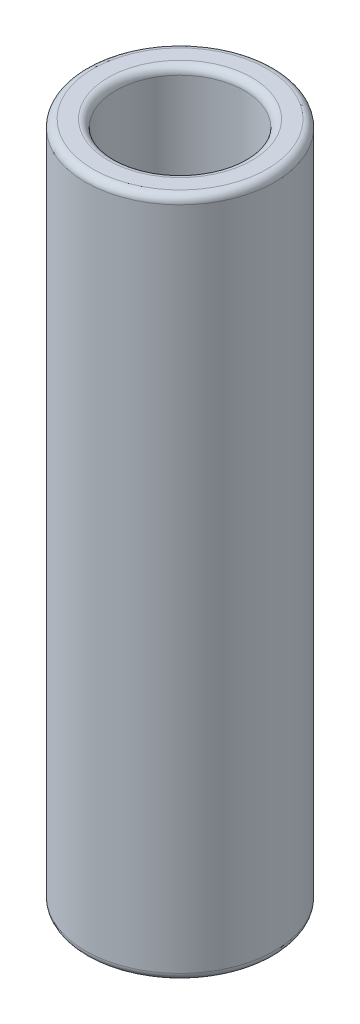
ISO-10303-21;
HEADER;
FILE_DESCRIPTION(('STEP AP214'),'2;1');
FILE_NAME('part.step','',(''),(''),'','','');
FILE_SCHEMA(('AUTOMOTIVE_DESIGN { 1 0 10303 214 1 1 1 1 }'));
ENDSEC;
DATA;
#1=APPLICATION_CONTEXT('core data for automotive mechanical design processes');
#2=APPLICATION_PROTOCOL_DEFINITION('international standard','automotive_design',2000,#1);
#3=PRODUCT_CONTEXT('',#1,'mechanical');
#4=PRODUCT('Part','Part','',(#3));
#5=PRODUCT_RELATED_PRODUCT_CATEGORY('part','',(#4));
#6=PRODUCT_DEFINITION_FORMATION('','',#4);
#7=PRODUCT_DEFINITION_CONTEXT('part definition',#1,'design');
#8=PRODUCT_DEFINITION('design','',#6,#7);
#9=PRODUCT_DEFINITION_SHAPE('','',#8);
#10=(LENGTH_UNIT() NAMED_UNIT(*) SI_UNIT(.MILLI.,.METRE.));
#11=(NAMED_UNIT(*) PLANE_ANGLE_UNIT() SI_UNIT($,.RADIAN.));
#12=(NAMED_UNIT(*) SI_UNIT($,.STERADIAN.) SOLID_ANGLE_UNIT());
#13=UNCERTAINTY_MEASURE_WITH_UNIT(LENGTH_MEASURE(1.E-05),#10,'distance_accuracy_value','');
#14=(GEOMETRIC_REPRESENTATION_CONTEXT(3) GLOBAL_UNCERTAINTY_ASSIGNED_CONTEXT((#13)) GLOBAL_UNIT_ASSIGNED_CONTEXT((#10,
#11,#12)) REPRESENTATION_CONTEXT('',''));
#15=CARTESIAN_POINT('',(0.,0.,0.));
#16=DIRECTION('',(0.,0.,1.));
#17=DIRECTION('',(1.,0.,0.));
#18=AXIS2_PLACEMENT_3D('',#15,#16,#17);
#19=CARTESIAN_POINT('',(0.,18.,0.));
#20=DIRECTION('',(0.,1.,0.));
#21=DIRECTION('',(0.,0.,1.));
#22=AXIS2_PLACEMENT_3D('',#19,#20,#21);
#23=PLANE('',#22);
#24=CARTESIAN_POINT('',(0.,18.,0.));
#25=DIRECTION('',(0.,1.,0.));
#26=DIRECTION('',(0.,0.,1.));
#27=AXIS2_PLACEMENT_3D('',#24,#25,#26);
#28=CIRCLE('',#27,1.9);
#29=CARTESIAN_POINT('',(0.,18.,1.9));
#30=VERTEX_POINT('',#29);
#31=EDGE_CURVE('E10',#30,#30,#28,.F.);
#32=ORIENTED_EDGE('',*,*,#31,.T.);
#33=EDGE_LOOP('',(#32));
#34=FACE_BOUND('',#33,.T.);
#35=CARTESIAN_POINT('',(0.,18.,0.));
#36=DIRECTION('',(0.,1.,0.));
#37=DIRECTION('',(0.,0.,1.));
#38=AXIS2_PLACEMENT_3D('',#35,#36,#37);
#39=CIRCLE('',#38,2.3);
#40=CARTESIAN_POINT('',(0.,18.,2.3));
#41=VERTEX_POINT('',#40);
#42=EDGE_CURVE('E42',#41,#41,#39,.T.);
#43=ORIENTED_EDGE('',*,*,#42,.T.);
#44=EDGE_LOOP('',(#43));
#45=FACE_BOUND('',#44,.T.);
#46=ADVANCED_FACE('F35',(#34,#45),#23,.T.);
#47=CARTESIAN_POINT('',(0.,0.,0.));
#48=DIRECTION('',(0.,1.,0.));
#49=DIRECTION('',(0.,0.,1.));
#50=AXIS2_PLACEMENT_3D('',#47,#48,#49);
#51=PLANE('',#50);
#52=CARTESIAN_POINT('',(0.,0.,0.));
#53=DIRECTION('',(0.,1.,0.));
#54=DIRECTION('',(0.,0.,1.));
#55=AXIS2_PLACEMENT_3D('',#52,#53,#54);
#56=CIRCLE('',#55,1.9);
#57=CARTESIAN_POINT('',(0.,0.,1.9));
#58=VERTEX_POINT('',#57);
#59=EDGE_CURVE('E61',#58,#58,#56,.T.);
#60=ORIENTED_EDGE('',*,*,#59,.T.);
#61=EDGE_LOOP('',(#60));
#62=FACE_BOUND('',#61,.T.);
#63=CARTESIAN_POINT('',(0.,0.,0.));
#64=DIRECTION('',(0.,1.,0.));
#65=DIRECTION('',(0.,0.,1.));
#66=AXIS2_PLACEMENT_3D('',#63,#64,#65);
#67=CIRCLE('',#66,2.3);
#68=CARTESIAN_POINT('',(0.,0.,2.3));
#69=VERTEX_POINT('',#68);
#70=EDGE_CURVE('E64',#69,#69,#67,.F.);
#71=ORIENTED_EDGE('',*,*,#70,.T.);
#72=EDGE_LOOP('',(#71));
#73=FACE_BOUND('',#72,.T.);
#74=ADVANCED_FACE('F68',(#62,#73),#51,.F.);
#75=CARTESIAN_POINT('',(0.,18.,0.));
#76=DIRECTION('',(0.,-1.,0.));
#77=DIRECTION('',(0.,0.,-1.));
#78=AXIS2_PLACEMENT_3D('',#75,#76,#77);
#79=CYLINDRICAL_SURFACE('',#78,2.5);
#80=CARTESIAN_POINT('',(0.,0.199999999999999,0.));
#81=DIRECTION('',(0.,1.,0.));
#82=DIRECTION('',(0.,0.,1.));
#83=AXIS2_PLACEMENT_3D('',#80,#81,#82);
#84=CIRCLE('',#83,2.5);
#85=CARTESIAN_POINT('',(0.,0.199999999999999,2.5));
#86=VERTEX_POINT('',#85);
#87=EDGE_CURVE('E46',#86,#86,#84,.T.);
#88=ORIENTED_EDGE('',*,*,#87,.T.);
#89=EDGE_LOOP('',(#88));
#90=FACE_BOUND('',#89,.T.);
#91=CARTESIAN_POINT('',(0.,17.8,0.));
#92=DIRECTION('',(0.,1.,0.));
#93=DIRECTION('',(0.,0.,1.));
#94=AXIS2_PLACEMENT_3D('',#91,#92,#93);
#95=CIRCLE('',#94,2.5);
#96=CARTESIAN_POINT('',(0.,17.8,2.5));
#97=VERTEX_POINT('',#96);
#98=EDGE_CURVE('E50',#97,#97,#95,.F.);
#99=ORIENTED_EDGE('',*,*,#98,.T.);
#100=EDGE_LOOP('',(#99));
#101=FACE_BOUND('',#100,.T.);
#102=ADVANCED_FACE('F78',(#90,#101),#79,.T.);
#103=CARTESIAN_POINT('',(0.,18.,0.));
#104=DIRECTION('',(0.,-1.,0.));
#105=DIRECTION('',(0.,0.,-1.));
#106=AXIS2_PLACEMENT_3D('',#103,#104,#105);
#107=CYLINDRICAL_SURFACE('',#106,1.7);
#108=CARTESIAN_POINT('',(0.,0.199999999999999,0.));
#109=DIRECTION('',(0.,1.,0.));
#110=DIRECTION('',(0.,0.,1.));
#111=AXIS2_PLACEMENT_3D('',#108,#109,#110);
#112=CIRCLE('',#111,1.7);
#113=CARTESIAN_POINT('',(0.,0.199999999999999,1.7));
#114=VERTEX_POINT('',#113);
#115=EDGE_CURVE('E55',#114,#114,#112,.F.);
#116=ORIENTED_EDGE('',*,*,#115,.T.);
#117=EDGE_LOOP('',(#116));
#118=FACE_BOUND('',#117,.T.);
#119=CARTESIAN_POINT('',(0.,17.8,0.));
#120=DIRECTION('',(0.,1.,0.));
#121=DIRECTION('',(0.,0.,1.));
#122=AXIS2_PLACEMENT_3D('',#119,#120,#121);
#123=CIRCLE('',#122,1.7);
#124=CARTESIAN_POINT('',(0.,17.8,1.7));
#125=VERTEX_POINT('',#124);
#126=EDGE_CURVE('E58',#125,#125,#123,.T.);
#127=ORIENTED_EDGE('',*,*,#126,.T.);
#128=EDGE_LOOP('',(#127));
#129=FACE_BOUND('',#128,.T.);
#130=ADVANCED_FACE('F81',(#118,#129),#107,.F.);
#131=CARTESIAN_POINT('',(0.,0.199999999999999,0.));
#132=DIRECTION('',(0.,1.,0.));
#133=DIRECTION('',(0.,0.,1.));
#134=AXIS2_PLACEMENT_3D('',#131,#132,#133);
#135=TOROIDAL_SURFACE('',#134,1.9,0.2);
#136=ORIENTED_EDGE('',*,*,#115,.F.);
#137=EDGE_LOOP('',(#136));
#138=FACE_BOUND('',#137,.T.);
#139=ORIENTED_EDGE('',*,*,#59,.F.);
#140=EDGE_LOOP('',(#139));
#141=FACE_BOUND('',#140,.T.);
#142=ADVANCED_FACE('F74',(#138,#141),#135,.T.);
#143=CARTESIAN_POINT('',(0.,0.199999999999999,0.));
#144=DIRECTION('',(0.,1.,0.));
#145=DIRECTION('',(0.,0.,1.));
#146=AXIS2_PLACEMENT_3D('',#143,#144,#145);
#147=TOROIDAL_SURFACE('',#146,2.3,0.2);
#148=ORIENTED_EDGE('',*,*,#70,.F.);
#149=EDGE_LOOP('',(#148));
#150=FACE_BOUND('',#149,.T.);
#151=ORIENTED_EDGE('',*,*,#87,.F.);
#152=EDGE_LOOP('',(#151));
#153=FACE_BOUND('',#152,.T.);
#154=ADVANCED_FACE('F70',(#150,#153),#147,.T.);
#155=CARTESIAN_POINT('',(0.,17.8,0.));
#156=DIRECTION('',(0.,1.,0.));
#157=DIRECTION('',(0.,0.,1.));
#158=AXIS2_PLACEMENT_3D('',#155,#156,#157);
#159=TOROIDAL_SURFACE('',#158,1.9,0.2);
#160=ORIENTED_EDGE('',*,*,#31,.F.);
#161=EDGE_LOOP('',(#160));
#162=FACE_BOUND('',#161,.T.);
#163=ORIENTED_EDGE('',*,*,#126,.F.);
#164=EDGE_LOOP('',(#163));
#165=FACE_BOUND('',#164,.T.);
#166=ADVANCED_FACE('F73',(#162,#165),#159,.T.);
#167=CARTESIAN_POINT('',(0.,17.8,0.));
#168=DIRECTION('',(0.,1.,0.));
#169=DIRECTION('',(0.,0.,1.));
#170=AXIS2_PLACEMENT_3D('',#167,#168,#169);
#171=TOROIDAL_SURFACE('',#170,2.3,0.2);
#172=ORIENTED_EDGE('',*,*,#98,.F.);
#173=EDGE_LOOP('',(#172));
#174=FACE_BOUND('',#173,.T.);
#175=ORIENTED_EDGE('',*,*,#42,.F.);
#176=EDGE_LOOP('',(#175));
#177=FACE_BOUND('',#176,.T.);
#178=ADVANCED_FACE('F37',(#174,#177),#171,.T.);
#179=CLOSED_SHELL('',(#46,#74,#102,#130,#142,#154,#166,#178));
#180=MANIFOLD_SOLID_BREP('B2',#179);
#181=ADVANCED_BREP_SHAPE_REPRESENTATION('',(#18,#180),#14);
#182=SHAPE_DEFINITION_REPRESENTATION(#9,#181);
ENDSEC;
END-ISO-10303-21;
